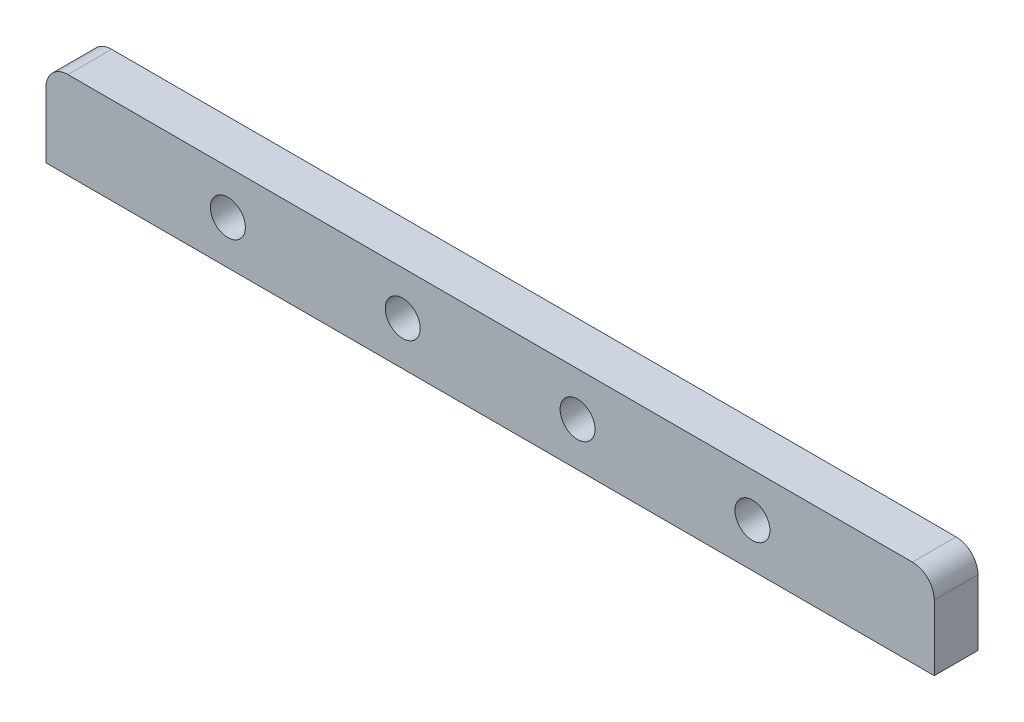
ISO-10303-21;
HEADER;
FILE_DESCRIPTION(('STEP AP214'),'2;1');
FILE_NAME('part.step','',(''),(''),'','','');
FILE_SCHEMA(('AUTOMOTIVE_DESIGN { 1 0 10303 214 1 1 1 1 }'));
ENDSEC;
DATA;
#1=APPLICATION_CONTEXT('core data for automotive mechanical design processes');
#2=APPLICATION_PROTOCOL_DEFINITION('international standard','automotive_design',2000,#1);
#3=PRODUCT_CONTEXT('',#1,'mechanical');
#4=PRODUCT('Part','Part','',(#3));
#5=PRODUCT_RELATED_PRODUCT_CATEGORY('part','',(#4));
#6=PRODUCT_DEFINITION_FORMATION('','',#4);
#7=PRODUCT_DEFINITION_CONTEXT('part definition',#1,'design');
#8=PRODUCT_DEFINITION('design','',#6,#7);
#9=PRODUCT_DEFINITION_SHAPE('','',#8);
#10=(LENGTH_UNIT() NAMED_UNIT(*) SI_UNIT(.MILLI.,.METRE.));
#11=(NAMED_UNIT(*) PLANE_ANGLE_UNIT() SI_UNIT($,.RADIAN.));
#12=(NAMED_UNIT(*) SI_UNIT($,.STERADIAN.) SOLID_ANGLE_UNIT());
#13=UNCERTAINTY_MEASURE_WITH_UNIT(LENGTH_MEASURE(1.E-05),#10,'distance_accuracy_value','');
#14=(GEOMETRIC_REPRESENTATION_CONTEXT(3) GLOBAL_UNCERTAINTY_ASSIGNED_CONTEXT((#13)) GLOBAL_UNIT_ASSIGNED_CONTEXT((#10,
#11,#12)) REPRESENTATION_CONTEXT('',''));
#15=CARTESIAN_POINT('',(0.,0.,0.));
#16=DIRECTION('',(0.,0.,1.));
#17=DIRECTION('',(1.,0.,0.));
#18=AXIS2_PLACEMENT_3D('',#15,#16,#17);
#19=CARTESIAN_POINT('',(-50.8,0.,5.));
#20=DIRECTION('',(0.,1.,0.));
#21=DIRECTION('',(0.,0.,1.));
#22=AXIS2_PLACEMENT_3D('',#19,#20,#21);
#23=PLANE('',#22);
#24=DIRECTION('',(1.,0.,0.));
#25=VECTOR('',#24,1.);
#26=CARTESIAN_POINT('',(-50.8,0.,0.));
#27=LINE('',#26,#25);
#28=CARTESIAN_POINT('',(-50.8,0.,0.));
#29=VERTEX_POINT('',#28);
#30=CARTESIAN_POINT('',(50.8,0.,0.));
#31=VERTEX_POINT('',#30);
#32=EDGE_CURVE('E109',#29,#31,#27,.T.);
#33=ORIENTED_EDGE('',*,*,#32,.T.);
#34=DIRECTION('',(0.,0.,-1.));
#35=VECTOR('',#34,1.);
#36=CARTESIAN_POINT('',(50.8,0.,5.));
#37=LINE('',#36,#35);
#38=CARTESIAN_POINT('',(50.8,0.,5.));
#39=VERTEX_POINT('',#38);
#40=EDGE_CURVE('E96',#39,#31,#37,.T.);
#41=ORIENTED_EDGE('',*,*,#40,.F.);
#42=DIRECTION('',(1.,0.,0.));
#43=VECTOR('',#42,1.);
#44=CARTESIAN_POINT('',(-50.8,0.,5.));
#45=LINE('',#44,#43);
#46=CARTESIAN_POINT('',(-50.8,0.,5.));
#47=VERTEX_POINT('',#46);
#48=EDGE_CURVE('E100',#47,#39,#45,.T.);
#49=ORIENTED_EDGE('',*,*,#48,.F.);
#50=DIRECTION('',(0.,0.,-1.));
#51=VECTOR('',#50,1.);
#52=CARTESIAN_POINT('',(-50.8,0.,5.));
#53=LINE('',#52,#51);
#54=EDGE_CURVE('E111',#47,#29,#53,.T.);
#55=ORIENTED_EDGE('',*,*,#54,.T.);
#56=EDGE_LOOP('',(#33,#41,#49,#55));
#57=FACE_BOUND('',#56,.T.);
#58=ADVANCED_FACE('F38',(#57),#23,.F.);
#59=CARTESIAN_POINT('',(50.8,0.,5.));
#60=DIRECTION('',(-1.,0.,0.));
#61=DIRECTION('',(0.,0.,1.));
#62=AXIS2_PLACEMENT_3D('',#59,#60,#61);
#63=PLANE('',#62);
#64=DIRECTION('',(0.,1.,0.));
#65=VECTOR('',#64,1.);
#66=CARTESIAN_POINT('',(50.8,0.,0.));
#67=LINE('',#66,#65);
#68=CARTESIAN_POINT('',(50.8,7.5,0.));
#69=VERTEX_POINT('',#68);
#70=EDGE_CURVE('E137',#31,#69,#67,.T.);
#71=ORIENTED_EDGE('',*,*,#70,.T.);
#72=DIRECTION('',(0.,0.,-1.));
#73=VECTOR('',#72,1.);
#74=CARTESIAN_POINT('',(50.8,7.5,5.));
#75=LINE('',#74,#73);
#76=CARTESIAN_POINT('',(50.8,7.5,5.));
#77=VERTEX_POINT('',#76);
#78=EDGE_CURVE('E61',#69,#77,#75,.F.);
#79=ORIENTED_EDGE('',*,*,#78,.T.);
#80=DIRECTION('',(0.,1.,0.));
#81=VECTOR('',#80,1.);
#82=CARTESIAN_POINT('',(50.8,0.,5.));
#83=LINE('',#82,#81);
#84=EDGE_CURVE('E92',#39,#77,#83,.T.);
#85=ORIENTED_EDGE('',*,*,#84,.F.);
#86=ORIENTED_EDGE('',*,*,#40,.T.);
#87=EDGE_LOOP('',(#71,#79,#85,#86));
#88=FACE_BOUND('',#87,.T.);
#89=ADVANCED_FACE('F94',(#88),#63,.F.);
#90=CARTESIAN_POINT('',(-50.8,10.,5.));
#91=DIRECTION('',(0.,1.,0.));
#92=DIRECTION('',(0.,0.,1.));
#93=AXIS2_PLACEMENT_3D('',#90,#91,#92);
#94=PLANE('',#93);
#95=DIRECTION('',(1.,0.,0.));
#96=VECTOR('',#95,1.);
#97=CARTESIAN_POINT('',(-50.8,10.,5.));
#98=LINE('',#97,#96);
#99=CARTESIAN_POINT('',(-48.3,10.,5.));
#100=VERTEX_POINT('',#99);
#101=CARTESIAN_POINT('',(48.3,10.,5.));
#102=VERTEX_POINT('',#101);
#103=EDGE_CURVE('E99',#100,#102,#98,.T.);
#104=ORIENTED_EDGE('',*,*,#103,.T.);
#105=DIRECTION('',(0.,0.,-1.));
#106=VECTOR('',#105,1.);
#107=CARTESIAN_POINT('',(48.3,10.,0.));
#108=LINE('',#107,#106);
#109=CARTESIAN_POINT('',(48.3,10.,0.));
#110=VERTEX_POINT('',#109);
#111=EDGE_CURVE('E113',#102,#110,#108,.T.);
#112=ORIENTED_EDGE('',*,*,#111,.T.);
#113=DIRECTION('',(1.,0.,0.));
#114=VECTOR('',#113,1.);
#115=CARTESIAN_POINT('',(-50.8,10.,0.));
#116=LINE('',#115,#114);
#117=CARTESIAN_POINT('',(-48.3,10.,0.));
#118=VERTEX_POINT('',#117);
#119=EDGE_CURVE('E138',#118,#110,#116,.T.);
#120=ORIENTED_EDGE('',*,*,#119,.F.);
#121=DIRECTION('',(0.,0.,-1.));
#122=VECTOR('',#121,1.);
#123=CARTESIAN_POINT('',(-48.3,10.,5.));
#124=LINE('',#123,#122);
#125=EDGE_CURVE('E110',#118,#100,#124,.F.);
#126=ORIENTED_EDGE('',*,*,#125,.T.);
#127=EDGE_LOOP('',(#104,#112,#120,#126));
#128=FACE_BOUND('',#127,.T.);
#129=ADVANCED_FACE('F129',(#128),#94,.T.);
#130=CARTESIAN_POINT('',(-50.8,0.,5.));
#131=DIRECTION('',(-1.,0.,0.));
#132=DIRECTION('',(0.,0.,1.));
#133=AXIS2_PLACEMENT_3D('',#130,#131,#132);
#134=PLANE('',#133);
#135=DIRECTION('',(0.,1.,0.));
#136=VECTOR('',#135,1.);
#137=CARTESIAN_POINT('',(-50.8,0.,5.));
#138=LINE('',#137,#136);
#139=CARTESIAN_POINT('',(-50.8,7.5,5.));
#140=VERTEX_POINT('',#139);
#141=EDGE_CURVE('E104',#47,#140,#138,.T.);
#142=ORIENTED_EDGE('',*,*,#141,.T.);
#143=DIRECTION('',(0.,0.,-1.));
#144=VECTOR('',#143,1.);
#145=CARTESIAN_POINT('',(-50.8,7.5,5.));
#146=LINE('',#145,#144);
#147=CARTESIAN_POINT('',(-50.8,7.5,0.));
#148=VERTEX_POINT('',#147);
#149=EDGE_CURVE('E11',#140,#148,#146,.T.);
#150=ORIENTED_EDGE('',*,*,#149,.T.);
#151=DIRECTION('',(0.,1.,0.));
#152=VECTOR('',#151,1.);
#153=CARTESIAN_POINT('',(-50.8,0.,0.));
#154=LINE('',#153,#152);
#155=EDGE_CURVE('E106',#29,#148,#154,.T.);
#156=ORIENTED_EDGE('',*,*,#155,.F.);
#157=ORIENTED_EDGE('',*,*,#54,.F.);
#158=EDGE_LOOP('',(#142,#150,#156,#157));
#159=FACE_BOUND('',#158,.T.);
#160=ADVANCED_FACE('F147',(#159),#134,.T.);
#161=CARTESIAN_POINT('',(0.,0.,5.));
#162=DIRECTION('',(0.,0.,1.));
#163=DIRECTION('',(1.,0.,0.));
#164=AXIS2_PLACEMENT_3D('',#161,#162,#163);
#165=PLANE('',#164);
#166=CARTESIAN_POINT('',(-30.,4.99999999999999,5.));
#167=DIRECTION('',(0.,0.,1.));
#168=DIRECTION('',(1.,0.,0.));
#169=AXIS2_PLACEMENT_3D('',#166,#167,#168);
#170=CIRCLE('',#169,2.);
#171=CARTESIAN_POINT('',(-28.,4.99999999999999,5.));
#172=VERTEX_POINT('',#171);
#173=EDGE_CURVE('E193',#172,#172,#170,.T.);
#174=ORIENTED_EDGE('',*,*,#173,.F.);
#175=EDGE_LOOP('',(#174));
#176=FACE_BOUND('',#175,.T.);
#177=CARTESIAN_POINT('',(-10.,4.99999999999999,5.));
#178=DIRECTION('',(0.,0.,1.));
#179=DIRECTION('',(1.,0.,0.));
#180=AXIS2_PLACEMENT_3D('',#177,#178,#179);
#181=CIRCLE('',#180,2.);
#182=CARTESIAN_POINT('',(-8.,4.99999999999999,5.));
#183=VERTEX_POINT('',#182);
#184=EDGE_CURVE('E198',#183,#183,#181,.T.);
#185=ORIENTED_EDGE('',*,*,#184,.F.);
#186=EDGE_LOOP('',(#185));
#187=FACE_BOUND('',#186,.T.);
#188=CARTESIAN_POINT('',(10.,4.99999999999999,5.));
#189=DIRECTION('',(0.,0.,1.));
#190=DIRECTION('',(1.,0.,0.));
#191=AXIS2_PLACEMENT_3D('',#188,#189,#190);
#192=CIRCLE('',#191,2.);
#193=CARTESIAN_POINT('',(12.,4.99999999999999,5.));
#194=VERTEX_POINT('',#193);
#195=EDGE_CURVE('E204',#194,#194,#192,.T.);
#196=ORIENTED_EDGE('',*,*,#195,.F.);
#197=EDGE_LOOP('',(#196));
#198=FACE_BOUND('',#197,.T.);
#199=CARTESIAN_POINT('',(30.,4.99999999999999,5.));
#200=DIRECTION('',(0.,0.,1.));
#201=DIRECTION('',(1.,0.,0.));
#202=AXIS2_PLACEMENT_3D('',#199,#200,#201);
#203=CIRCLE('',#202,2.00000000000001);
#204=CARTESIAN_POINT('',(32.,4.99999999999999,5.));
#205=VERTEX_POINT('',#204);
#206=EDGE_CURVE('E210',#205,#205,#203,.T.);
#207=ORIENTED_EDGE('',*,*,#206,.F.);
#208=EDGE_LOOP('',(#207));
#209=FACE_BOUND('',#208,.T.);
#210=ORIENTED_EDGE('',*,*,#84,.T.);
#211=CARTESIAN_POINT('',(48.3,7.5,5.));
#212=DIRECTION('',(0.,0.,1.));
#213=DIRECTION('',(1.,0.,0.));
#214=AXIS2_PLACEMENT_3D('',#211,#212,#213);
#215=CIRCLE('',#214,2.5);
#216=EDGE_CURVE('E46',#77,#102,#215,.T.);
#217=ORIENTED_EDGE('',*,*,#216,.T.);
#218=ORIENTED_EDGE('',*,*,#103,.F.);
#219=CARTESIAN_POINT('',(-48.3,7.5,5.));
#220=DIRECTION('',(0.,0.,1.));
#221=DIRECTION('',(1.,0.,0.));
#222=AXIS2_PLACEMENT_3D('',#219,#220,#221);
#223=CIRCLE('',#222,2.5);
#224=EDGE_CURVE('E53',#100,#140,#223,.T.);
#225=ORIENTED_EDGE('',*,*,#224,.T.);
#226=ORIENTED_EDGE('',*,*,#141,.F.);
#227=ORIENTED_EDGE('',*,*,#48,.T.);
#228=EDGE_LOOP('',(#210,#217,#218,#225,#226,#227));
#229=FACE_BOUND('',#228,.T.);
#230=ADVANCED_FACE('F103',(#176,#187,#198,#209,#229),#165,.T.);
#231=CARTESIAN_POINT('',(0.,0.,0.));
#232=DIRECTION('',(0.,0.,1.));
#233=DIRECTION('',(1.,0.,0.));
#234=AXIS2_PLACEMENT_3D('',#231,#232,#233);
#235=PLANE('',#234);
#236=CARTESIAN_POINT('',(-30.,4.99999999999999,0.));
#237=DIRECTION('',(0.,0.,1.));
#238=DIRECTION('',(1.,0.,0.));
#239=AXIS2_PLACEMENT_3D('',#236,#237,#238);
#240=CIRCLE('',#239,2.);
#241=CARTESIAN_POINT('',(-28.,4.99999999999999,0.));
#242=VERTEX_POINT('',#241);
#243=EDGE_CURVE('E141',#242,#242,#240,.F.);
#244=ORIENTED_EDGE('',*,*,#243,.F.);
#245=EDGE_LOOP('',(#244));
#246=FACE_BOUND('',#245,.T.);
#247=CARTESIAN_POINT('',(-10.,4.99999999999999,0.));
#248=DIRECTION('',(0.,0.,1.));
#249=DIRECTION('',(1.,0.,0.));
#250=AXIS2_PLACEMENT_3D('',#247,#248,#249);
#251=CIRCLE('',#250,2.);
#252=CARTESIAN_POINT('',(-8.,4.99999999999999,0.));
#253=VERTEX_POINT('',#252);
#254=EDGE_CURVE('E194',#253,#253,#251,.F.);
#255=ORIENTED_EDGE('',*,*,#254,.F.);
#256=EDGE_LOOP('',(#255));
#257=FACE_BOUND('',#256,.T.);
#258=CARTESIAN_POINT('',(10.,4.99999999999999,0.));
#259=DIRECTION('',(0.,0.,1.));
#260=DIRECTION('',(1.,0.,0.));
#261=AXIS2_PLACEMENT_3D('',#258,#259,#260);
#262=CIRCLE('',#261,2.);
#263=CARTESIAN_POINT('',(12.,4.99999999999999,0.));
#264=VERTEX_POINT('',#263);
#265=EDGE_CURVE('E202',#264,#264,#262,.F.);
#266=ORIENTED_EDGE('',*,*,#265,.F.);
#267=EDGE_LOOP('',(#266));
#268=FACE_BOUND('',#267,.T.);
#269=CARTESIAN_POINT('',(30.,4.99999999999999,0.));
#270=DIRECTION('',(0.,0.,1.));
#271=DIRECTION('',(1.,0.,0.));
#272=AXIS2_PLACEMENT_3D('',#269,#270,#271);
#273=CIRCLE('',#272,2.00000000000001);
#274=CARTESIAN_POINT('',(32.,4.99999999999999,0.));
#275=VERTEX_POINT('',#274);
#276=EDGE_CURVE('E207',#275,#275,#273,.F.);
#277=ORIENTED_EDGE('',*,*,#276,.F.);
#278=EDGE_LOOP('',(#277));
#279=FACE_BOUND('',#278,.T.);
#280=ORIENTED_EDGE('',*,*,#119,.T.);
#281=CARTESIAN_POINT('',(48.3,7.5,0.));
#282=DIRECTION('',(0.,0.,1.));
#283=DIRECTION('',(1.,0.,0.));
#284=AXIS2_PLACEMENT_3D('',#281,#282,#283);
#285=CIRCLE('',#284,2.5);
#286=EDGE_CURVE('E122',#110,#69,#285,.F.);
#287=ORIENTED_EDGE('',*,*,#286,.T.);
#288=ORIENTED_EDGE('',*,*,#70,.F.);
#289=ORIENTED_EDGE('',*,*,#32,.F.);
#290=ORIENTED_EDGE('',*,*,#155,.T.);
#291=CARTESIAN_POINT('',(-48.3,7.5,0.));
#292=DIRECTION('',(0.,0.,1.));
#293=DIRECTION('',(1.,0.,0.));
#294=AXIS2_PLACEMENT_3D('',#291,#292,#293);
#295=CIRCLE('',#294,2.5);
#296=EDGE_CURVE('E120',#148,#118,#295,.F.);
#297=ORIENTED_EDGE('',*,*,#296,.T.);
#298=EDGE_LOOP('',(#280,#287,#288,#289,#290,#297));
#299=FACE_BOUND('',#298,.T.);
#300=ADVANCED_FACE('F136',(#246,#257,#268,#279,#299),#235,.F.);
#301=CARTESIAN_POINT('',(30.,4.99999999999999,-5.6568542494924));
#302=DIRECTION('',(0.,0.,1.));
#303=DIRECTION('',(1.,0.,0.));
#304=AXIS2_PLACEMENT_3D('',#301,#302,#303);
#305=CYLINDRICAL_SURFACE('',#304,2.00000000000001);
#306=ORIENTED_EDGE('',*,*,#276,.T.);
#307=EDGE_LOOP('',(#306));
#308=FACE_BOUND('',#307,.T.);
#309=ORIENTED_EDGE('',*,*,#206,.T.);
#310=EDGE_LOOP('',(#309));
#311=FACE_BOUND('',#310,.T.);
#312=ADVANCED_FACE('F168',(#308,#311),#305,.F.);
#313=CARTESIAN_POINT('',(10.,4.99999999999999,-5.6568542494924));
#314=DIRECTION('',(0.,0.,1.));
#315=DIRECTION('',(1.,0.,0.));
#316=AXIS2_PLACEMENT_3D('',#313,#314,#315);
#317=CYLINDRICAL_SURFACE('',#316,2.);
#318=ORIENTED_EDGE('',*,*,#265,.T.);
#319=EDGE_LOOP('',(#318));
#320=FACE_BOUND('',#319,.T.);
#321=ORIENTED_EDGE('',*,*,#195,.T.);
#322=EDGE_LOOP('',(#321));
#323=FACE_BOUND('',#322,.T.);
#324=ADVANCED_FACE('F175',(#320,#323),#317,.F.);
#325=CARTESIAN_POINT('',(-10.,4.99999999999999,-5.6568542494924));
#326=DIRECTION('',(0.,0.,1.));
#327=DIRECTION('',(1.,0.,0.));
#328=AXIS2_PLACEMENT_3D('',#325,#326,#327);
#329=CYLINDRICAL_SURFACE('',#328,2.);
#330=ORIENTED_EDGE('',*,*,#254,.T.);
#331=EDGE_LOOP('',(#330));
#332=FACE_BOUND('',#331,.T.);
#333=ORIENTED_EDGE('',*,*,#184,.T.);
#334=EDGE_LOOP('',(#333));
#335=FACE_BOUND('',#334,.T.);
#336=ADVANCED_FACE('F179',(#332,#335),#329,.F.);
#337=CARTESIAN_POINT('',(-30.,4.99999999999999,-5.6568542494924));
#338=DIRECTION('',(0.,0.,1.));
#339=DIRECTION('',(1.,0.,0.));
#340=AXIS2_PLACEMENT_3D('',#337,#338,#339);
#341=CYLINDRICAL_SURFACE('',#340,2.);
#342=ORIENTED_EDGE('',*,*,#243,.T.);
#343=EDGE_LOOP('',(#342));
#344=FACE_BOUND('',#343,.T.);
#345=ORIENTED_EDGE('',*,*,#173,.T.);
#346=EDGE_LOOP('',(#345));
#347=FACE_BOUND('',#346,.T.);
#348=ADVANCED_FACE('F154',(#344,#347),#341,.F.);
#349=CARTESIAN_POINT('',(48.3,7.5,5.));
#350=DIRECTION('',(0.,0.,1.));
#351=DIRECTION('',(1.,0.,0.));
#352=AXIS2_PLACEMENT_3D('',#349,#350,#351);
#353=CYLINDRICAL_SURFACE('',#352,2.5);
#354=ORIENTED_EDGE('',*,*,#216,.F.);
#355=ORIENTED_EDGE('',*,*,#78,.F.);
#356=ORIENTED_EDGE('',*,*,#286,.F.);
#357=ORIENTED_EDGE('',*,*,#111,.F.);
#358=EDGE_LOOP('',(#354,#355,#356,#357));
#359=FACE_BOUND('',#358,.T.);
#360=ADVANCED_FACE('F134',(#359),#353,.T.);
#361=CARTESIAN_POINT('',(-48.3,7.5,5.));
#362=DIRECTION('',(0.,0.,-1.));
#363=DIRECTION('',(-1.,0.,0.));
#364=AXIS2_PLACEMENT_3D('',#361,#362,#363);
#365=CYLINDRICAL_SURFACE('',#364,2.5);
#366=ORIENTED_EDGE('',*,*,#224,.F.);
#367=ORIENTED_EDGE('',*,*,#125,.F.);
#368=ORIENTED_EDGE('',*,*,#296,.F.);
#369=ORIENTED_EDGE('',*,*,#149,.F.);
#370=EDGE_LOOP('',(#366,#367,#368,#369));
#371=FACE_BOUND('',#370,.T.);
#372=ADVANCED_FACE('F40',(#371),#365,.T.);
#373=CLOSED_SHELL('',(#58,#89,#129,#160,#230,#300,#312,#324,#336,#348,#360,#372));
#374=MANIFOLD_SOLID_BREP('B2',#373);
#375=ADVANCED_BREP_SHAPE_REPRESENTATION('',(#18,#374),#14);
#376=SHAPE_DEFINITION_REPRESENTATION(#9,#375);
ENDSEC;
END-ISO-10303-21;
